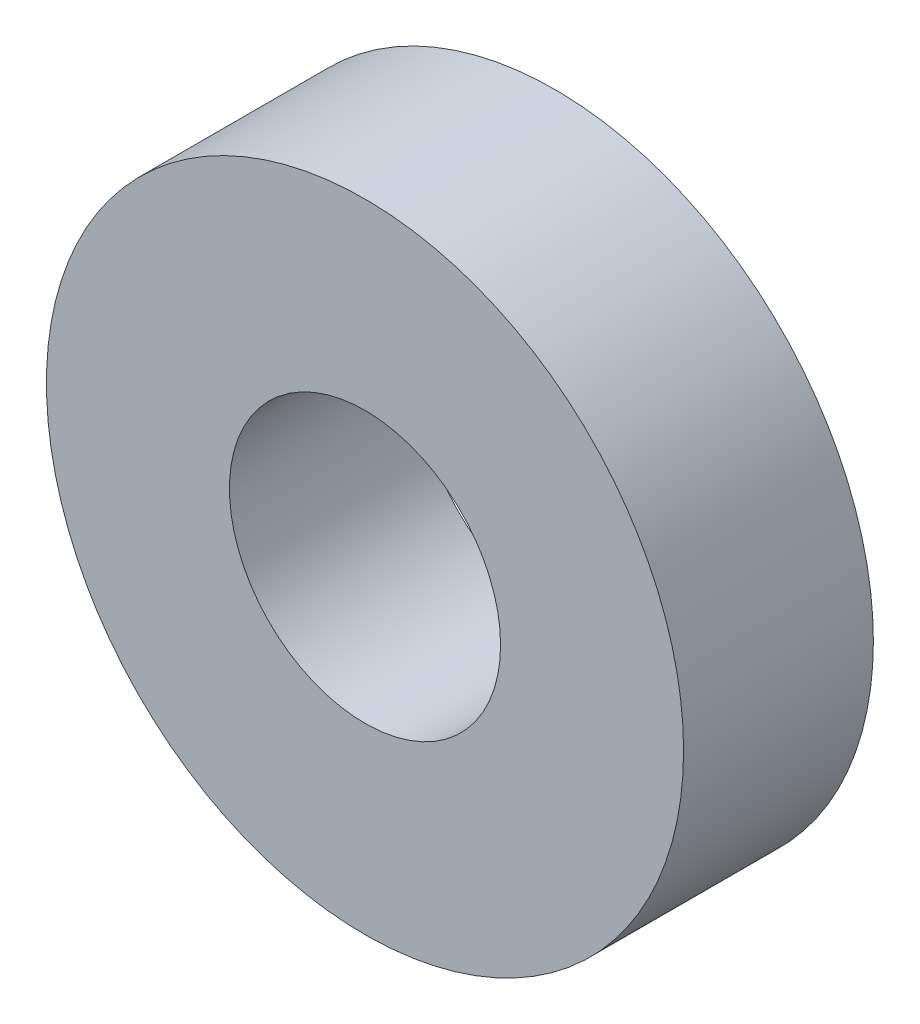
ISO-10303-21;
HEADER;
FILE_DESCRIPTION(('STEP AP214'),'2;1');
FILE_NAME('part.step','',(''),(''),'','','');
FILE_SCHEMA(('AUTOMOTIVE_DESIGN { 1 0 10303 214 1 1 1 1 }'));
ENDSEC;
DATA;
#1=APPLICATION_CONTEXT('core data for automotive mechanical design processes');
#2=APPLICATION_PROTOCOL_DEFINITION('international standard','automotive_design',2000,#1);
#3=PRODUCT_CONTEXT('',#1,'mechanical');
#4=PRODUCT('Part','Part','',(#3));
#5=PRODUCT_RELATED_PRODUCT_CATEGORY('part','',(#4));
#6=PRODUCT_DEFINITION_FORMATION('','',#4);
#7=PRODUCT_DEFINITION_CONTEXT('part definition',#1,'design');
#8=PRODUCT_DEFINITION('design','',#6,#7);
#9=PRODUCT_DEFINITION_SHAPE('','',#8);
#10=(LENGTH_UNIT() NAMED_UNIT(*) SI_UNIT(.MILLI.,.METRE.));
#11=(NAMED_UNIT(*) PLANE_ANGLE_UNIT() SI_UNIT($,.RADIAN.));
#12=(NAMED_UNIT(*) SI_UNIT($,.STERADIAN.) SOLID_ANGLE_UNIT());
#13=UNCERTAINTY_MEASURE_WITH_UNIT(LENGTH_MEASURE(1.E-05),#10,'distance_accuracy_value','');
#14=(GEOMETRIC_REPRESENTATION_CONTEXT(3) GLOBAL_UNCERTAINTY_ASSIGNED_CONTEXT((#13)) GLOBAL_UNIT_ASSIGNED_CONTEXT((#10,
#11,#12)) REPRESENTATION_CONTEXT('',''));
#15=CARTESIAN_POINT('',(0.,0.,0.));
#16=DIRECTION('',(0.,0.,1.));
#17=DIRECTION('',(1.,0.,0.));
#18=AXIS2_PLACEMENT_3D('',#15,#16,#17);
#19=CARTESIAN_POINT('',(0.,0.,14.));
#20=DIRECTION('',(0.,0.,1.));
#21=DIRECTION('',(1.,0.,0.));
#22=AXIS2_PLACEMENT_3D('',#19,#20,#21);
#23=PLANE('',#22);
#24=CARTESIAN_POINT('',(0.,0.,14.));
#25=DIRECTION('',(0.,0.,1.));
#26=DIRECTION('',(1.,0.,0.));
#27=AXIS2_PLACEMENT_3D('',#24,#25,#26);
#28=CIRCLE('',#27,23.5);
#29=CARTESIAN_POINT('',(23.5,0.,14.));
#30=VERTEX_POINT('',#29);
#31=EDGE_CURVE('E10',#30,#30,#28,.T.);
#32=ORIENTED_EDGE('',*,*,#31,.T.);
#33=EDGE_LOOP('',(#32));
#34=FACE_BOUND('',#33,.T.);
#35=CARTESIAN_POINT('',(0.,0.,14.));
#36=DIRECTION('',(0.,0.,1.));
#37=DIRECTION('',(1.,0.,0.));
#38=AXIS2_PLACEMENT_3D('',#35,#36,#37);
#39=CIRCLE('',#38,10.);
#40=CARTESIAN_POINT('',(10.,0.,14.));
#41=VERTEX_POINT('',#40);
#42=EDGE_CURVE('E42',#41,#41,#39,.T.);
#43=ORIENTED_EDGE('',*,*,#42,.F.);
#44=EDGE_LOOP('',(#43));
#45=FACE_BOUND('',#44,.T.);
#46=ADVANCED_FACE('F31',(#34,#45),#23,.T.);
#47=CARTESIAN_POINT('',(0.,0.,0.));
#48=DIRECTION('',(0.,0.,1.));
#49=DIRECTION('',(1.,0.,0.));
#50=AXIS2_PLACEMENT_3D('',#47,#48,#49);
#51=PLANE('',#50);
#52=CARTESIAN_POINT('',(0.,0.,0.));
#53=DIRECTION('',(0.,0.,1.));
#54=DIRECTION('',(1.,0.,0.));
#55=AXIS2_PLACEMENT_3D('',#52,#53,#54);
#56=CIRCLE('',#55,23.5);
#57=CARTESIAN_POINT('',(23.5,0.,0.));
#58=VERTEX_POINT('',#57);
#59=EDGE_CURVE('E35',#58,#58,#56,.T.);
#60=ORIENTED_EDGE('',*,*,#59,.F.);
#61=EDGE_LOOP('',(#60));
#62=FACE_BOUND('',#61,.T.);
#63=CARTESIAN_POINT('',(0.,0.,0.));
#64=DIRECTION('',(0.,0.,1.));
#65=DIRECTION('',(1.,0.,0.));
#66=AXIS2_PLACEMENT_3D('',#63,#64,#65);
#67=CIRCLE('',#66,10.);
#68=CARTESIAN_POINT('',(10.,0.,0.));
#69=VERTEX_POINT('',#68);
#70=EDGE_CURVE('E44',#69,#69,#67,.T.);
#71=ORIENTED_EDGE('',*,*,#70,.T.);
#72=EDGE_LOOP('',(#71));
#73=FACE_BOUND('',#72,.T.);
#74=ADVANCED_FACE('F54',(#62,#73),#51,.F.);
#75=CARTESIAN_POINT('',(0.,0.,14.));
#76=DIRECTION('',(0.,0.,-1.));
#77=DIRECTION('',(-1.,0.,0.));
#78=AXIS2_PLACEMENT_3D('',#75,#76,#77);
#79=CYLINDRICAL_SURFACE('',#78,23.5);
#80=ORIENTED_EDGE('',*,*,#31,.F.);
#81=EDGE_LOOP('',(#80));
#82=FACE_BOUND('',#81,.T.);
#83=ORIENTED_EDGE('',*,*,#59,.T.);
#84=EDGE_LOOP('',(#83));
#85=FACE_BOUND('',#84,.T.);
#86=ADVANCED_FACE('F33',(#82,#85),#79,.T.);
#87=CARTESIAN_POINT('',(0.,0.,14.));
#88=DIRECTION('',(0.,0.,-1.));
#89=DIRECTION('',(-1.,0.,0.));
#90=AXIS2_PLACEMENT_3D('',#87,#88,#89);
#91=CYLINDRICAL_SURFACE('',#90,10.);
#92=ORIENTED_EDGE('',*,*,#42,.T.);
#93=EDGE_LOOP('',(#92));
#94=FACE_BOUND('',#93,.T.);
#95=ORIENTED_EDGE('',*,*,#70,.F.);
#96=EDGE_LOOP('',(#95));
#97=FACE_BOUND('',#96,.T.);
#98=ADVANCED_FACE('F50',(#94,#97),#91,.F.);
#99=CLOSED_SHELL('',(#46,#74,#86,#98));
#100=MANIFOLD_SOLID_BREP('B2',#99);
#101=ADVANCED_BREP_SHAPE_REPRESENTATION('',(#18,#100),#14);
#102=SHAPE_DEFINITION_REPRESENTATION(#9,#101);
ENDSEC;
END-ISO-10303-21;
